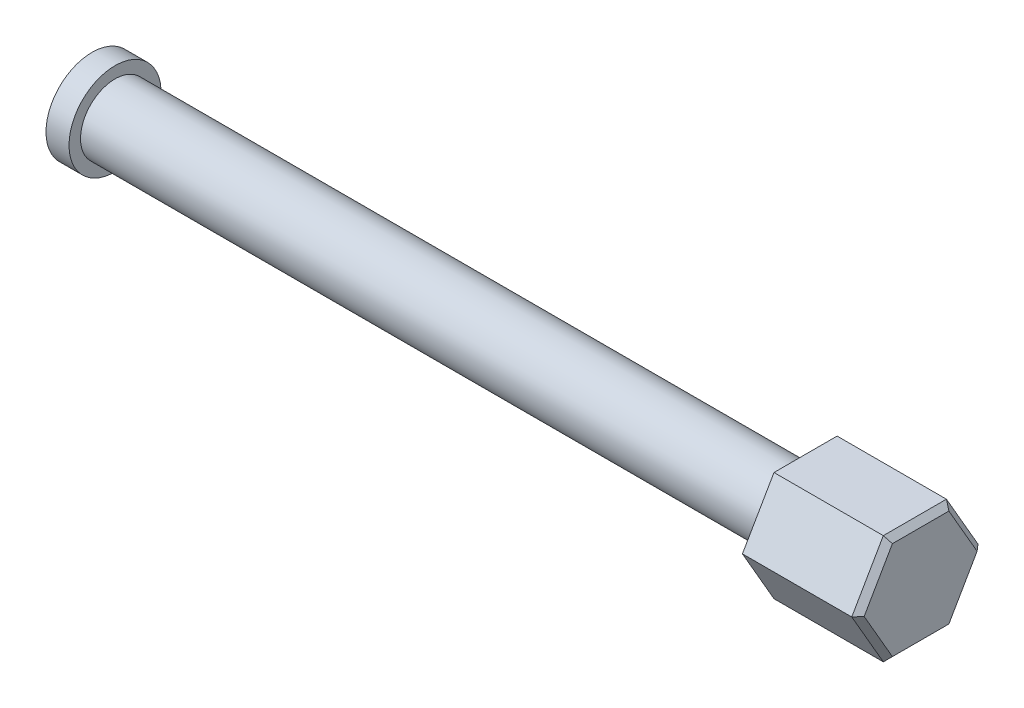
ISO-10303-21;
HEADER;
FILE_DESCRIPTION(('STEP AP214'),'2;1');
FILE_NAME('part.step','',(''),(''),'','','');
FILE_SCHEMA(('AUTOMOTIVE_DESIGN { 1 0 10303 214 1 1 1 1 }'));
ENDSEC;
DATA;
#1=APPLICATION_CONTEXT('core data for automotive mechanical design processes');
#2=APPLICATION_PROTOCOL_DEFINITION('international standard','automotive_design',2000,#1);
#3=PRODUCT_CONTEXT('',#1,'mechanical');
#4=PRODUCT('Part','Part','',(#3));
#5=PRODUCT_RELATED_PRODUCT_CATEGORY('part','',(#4));
#6=PRODUCT_DEFINITION_FORMATION('','',#4);
#7=PRODUCT_DEFINITION_CONTEXT('part definition',#1,'design');
#8=PRODUCT_DEFINITION('design','',#6,#7);
#9=PRODUCT_DEFINITION_SHAPE('','',#8);
#10=(LENGTH_UNIT() NAMED_UNIT(*) SI_UNIT(.MILLI.,.METRE.));
#11=(NAMED_UNIT(*) PLANE_ANGLE_UNIT() SI_UNIT($,.RADIAN.));
#12=(NAMED_UNIT(*) SI_UNIT($,.STERADIAN.) SOLID_ANGLE_UNIT());
#13=UNCERTAINTY_MEASURE_WITH_UNIT(LENGTH_MEASURE(1.E-05),#10,'distance_accuracy_value','');
#14=(GEOMETRIC_REPRESENTATION_CONTEXT(3) GLOBAL_UNCERTAINTY_ASSIGNED_CONTEXT((#13)) GLOBAL_UNIT_ASSIGNED_CONTEXT((#10,
#11,#12)) REPRESENTATION_CONTEXT('',''));
#15=CARTESIAN_POINT('',(0.,0.,0.));
#16=DIRECTION('',(0.,0.,1.));
#17=DIRECTION('',(1.,0.,0.));
#18=AXIS2_PLACEMENT_3D('',#15,#16,#17);
#19=CARTESIAN_POINT('',(59.3548577223939,0.,-6.));
#20=DIRECTION('',(1.,0.,0.));
#21=DIRECTION('',(0.,0.,-1.));
#22=AXIS2_PLACEMENT_3D('',#19,#20,#21);
#23=PLANE('',#22);
#24=CARTESIAN_POINT('',(59.3548577223939,0.,0.));
#25=DIRECTION('',(-1.,0.,0.));
#26=DIRECTION('',(0.,0.,1.));
#27=AXIS2_PLACEMENT_3D('',#24,#25,#26);
#28=CIRCLE('',#27,6.);
#29=CARTESIAN_POINT('',(59.3548577223939,0.,6.));
#30=VERTEX_POINT('',#29);
#31=EDGE_CURVE('E146',#30,#30,#28,.T.);
#32=ORIENTED_EDGE('',*,*,#31,.F.);
#33=EDGE_LOOP('',(#32));
#34=FACE_BOUND('',#33,.T.);
#35=DIRECTION('',(0.,0.866025403784439,-0.5));
#36=VECTOR('',#35,1.);
#37=CARTESIAN_POINT('',(59.3548577223939,-9.50000000000001,-5.48482755730145));
#38=LINE('',#37,#36);
#39=CARTESIAN_POINT('',(59.3548577223939,-9.50000000000001,-5.48482755730145));
#40=VERTEX_POINT('',#39);
#41=CARTESIAN_POINT('',(59.3548577223939,0.,-10.9696551146029));
#42=VERTEX_POINT('',#41);
#43=EDGE_CURVE('E201',#40,#42,#38,.T.);
#44=ORIENTED_EDGE('',*,*,#43,.F.);
#45=DIRECTION('',(0.,0.,-1.));
#46=VECTOR('',#45,1.);
#47=CARTESIAN_POINT('',(59.3548577223939,-9.50000000000001,5.48482755730145));
#48=LINE('',#47,#46);
#49=CARTESIAN_POINT('',(59.3548577223939,-9.50000000000001,5.48482755730145));
#50=VERTEX_POINT('',#49);
#51=EDGE_CURVE('E136',#50,#40,#48,.T.);
#52=ORIENTED_EDGE('',*,*,#51,.F.);
#53=DIRECTION('',(0.,-0.866025403784439,-0.5));
#54=VECTOR('',#53,1.);
#55=CARTESIAN_POINT('',(59.3548577223939,0.,10.9696551146029));
#56=LINE('',#55,#54);
#57=CARTESIAN_POINT('',(59.3548577223939,0.,10.9696551146029));
#58=VERTEX_POINT('',#57);
#59=EDGE_CURVE('E134',#58,#50,#56,.T.);
#60=ORIENTED_EDGE('',*,*,#59,.F.);
#61=DIRECTION('',(0.,-0.866025403784439,0.5));
#62=VECTOR('',#61,1.);
#63=CARTESIAN_POINT('',(59.3548577223939,9.50000000000001,5.48482755730145));
#64=LINE('',#63,#62);
#65=CARTESIAN_POINT('',(59.3548577223939,9.50000000000001,5.48482755730145));
#66=VERTEX_POINT('',#65);
#67=EDGE_CURVE('E116',#66,#58,#64,.T.);
#68=ORIENTED_EDGE('',*,*,#67,.F.);
#69=DIRECTION('',(0.,0.,1.));
#70=VECTOR('',#69,1.);
#71=CARTESIAN_POINT('',(59.3548577223939,9.50000000000001,-5.48482755730145));
#72=LINE('',#71,#70);
#73=CARTESIAN_POINT('',(59.3548577223939,9.50000000000001,-5.48482755730145));
#74=VERTEX_POINT('',#73);
#75=EDGE_CURVE('E124',#74,#66,#72,.T.);
#76=ORIENTED_EDGE('',*,*,#75,.F.);
#77=DIRECTION('',(0.,0.866025403784439,0.5));
#78=VECTOR('',#77,1.);
#79=CARTESIAN_POINT('',(59.3548577223939,0.,-10.9696551146029));
#80=LINE('',#79,#78);
#81=EDGE_CURVE('E129',#42,#74,#80,.T.);
#82=ORIENTED_EDGE('',*,*,#81,.F.);
#83=EDGE_LOOP('',(#44,#52,#60,#68,#76,#82));
#84=FACE_BOUND('',#83,.T.);
#85=ADVANCED_FACE('F39',(#34,#84),#23,.F.);
#86=CARTESIAN_POINT('',(-64.6451422776061,0.,0.));
#87=DIRECTION('',(1.,0.,0.));
#88=DIRECTION('',(0.,0.,-1.));
#89=AXIS2_PLACEMENT_3D('',#86,#87,#88);
#90=PLANE('',#89);
#91=CARTESIAN_POINT('',(-64.6451422776061,0.,0.));
#92=DIRECTION('',(-1.,0.,0.));
#93=DIRECTION('',(0.,0.,1.));
#94=AXIS2_PLACEMENT_3D('',#91,#92,#93);
#95=CIRCLE('',#94,3.);
#96=CARTESIAN_POINT('',(-64.6451422776061,0.,2.99999999999999));
#97=VERTEX_POINT('',#96);
#98=EDGE_CURVE('E210',#97,#97,#95,.T.);
#99=ORIENTED_EDGE('',*,*,#98,.F.);
#100=EDGE_LOOP('',(#99));
#101=FACE_BOUND('',#100,.T.);
#102=CARTESIAN_POINT('',(-64.6451422776061,0.,0.));
#103=DIRECTION('',(-1.,0.,0.));
#104=DIRECTION('',(0.,0.,1.));
#105=AXIS2_PLACEMENT_3D('',#102,#103,#104);
#106=CIRCLE('',#105,8.);
#107=CARTESIAN_POINT('',(-64.6451422776061,0.,8.));
#108=VERTEX_POINT('',#107);
#109=EDGE_CURVE('E161',#108,#108,#106,.T.);
#110=ORIENTED_EDGE('',*,*,#109,.T.);
#111=EDGE_LOOP('',(#110));
#112=FACE_BOUND('',#111,.T.);
#113=ADVANCED_FACE('F216',(#101,#112),#90,.F.);
#114=CARTESIAN_POINT('',(-81.5752481849163,0.,0.));
#115=DIRECTION('',(-1.,0.,0.));
#116=DIRECTION('',(0.,0.,1.));
#117=AXIS2_PLACEMENT_3D('',#114,#115,#116);
#118=CYLINDRICAL_SURFACE('',#117,8.);
#119=ORIENTED_EDGE('',*,*,#109,.F.);
#120=EDGE_LOOP('',(#119));
#121=FACE_BOUND('',#120,.T.);
#122=CARTESIAN_POINT('',(-60.6451422776061,0.,0.));
#123=DIRECTION('',(-1.,0.,0.));
#124=DIRECTION('',(0.,0.,1.));
#125=AXIS2_PLACEMENT_3D('',#122,#123,#124);
#126=CIRCLE('',#125,8.);
#127=CARTESIAN_POINT('',(-60.6451422776061,0.,8.));
#128=VERTEX_POINT('',#127);
#129=EDGE_CURVE('E158',#128,#128,#126,.T.);
#130=ORIENTED_EDGE('',*,*,#129,.T.);
#131=EDGE_LOOP('',(#130));
#132=FACE_BOUND('',#131,.T.);
#133=ADVANCED_FACE('F219',(#121,#132),#118,.T.);
#134=CARTESIAN_POINT('',(-60.6451422776061,0.,-8.));
#135=DIRECTION('',(-1.,0.,0.));
#136=DIRECTION('',(0.,0.,1.));
#137=AXIS2_PLACEMENT_3D('',#134,#135,#136);
#138=PLANE('',#137);
#139=ORIENTED_EDGE('',*,*,#129,.F.);
#140=EDGE_LOOP('',(#139));
#141=FACE_BOUND('',#140,.T.);
#142=CARTESIAN_POINT('',(-60.6451422776061,0.,0.));
#143=DIRECTION('',(-1.,0.,0.));
#144=DIRECTION('',(0.,0.,1.));
#145=AXIS2_PLACEMENT_3D('',#142,#143,#144);
#146=CIRCLE('',#145,6.);
#147=CARTESIAN_POINT('',(-60.6451422776061,0.,6.));
#148=VERTEX_POINT('',#147);
#149=EDGE_CURVE('E155',#148,#148,#146,.T.);
#150=ORIENTED_EDGE('',*,*,#149,.T.);
#151=EDGE_LOOP('',(#150));
#152=FACE_BOUND('',#151,.T.);
#153=ADVANCED_FACE('F225',(#141,#152),#138,.F.);
#154=CARTESIAN_POINT('',(-81.5752481849163,0.,0.));
#155=DIRECTION('',(-1.,0.,0.));
#156=DIRECTION('',(0.,0.,1.));
#157=AXIS2_PLACEMENT_3D('',#154,#155,#156);
#158=CYLINDRICAL_SURFACE('',#157,6.);
#159=ORIENTED_EDGE('',*,*,#149,.F.);
#160=EDGE_LOOP('',(#159));
#161=FACE_BOUND('',#160,.T.);
#162=ORIENTED_EDGE('',*,*,#31,.T.);
#163=EDGE_LOOP('',(#162));
#164=FACE_BOUND('',#163,.T.);
#165=ADVANCED_FACE('F231',(#161,#164),#158,.T.);
#166=CARTESIAN_POINT('',(59.3548577223939,-9.50000000000001,-5.48482755730145));
#167=DIRECTION('',(0.,-0.5,-0.866025403784439));
#168=DIRECTION('',(0.,0.866025403784439,-0.5));
#169=AXIS2_PLACEMENT_3D('',#166,#167,#168);
#170=PLANE('',#169);
#171=DIRECTION('',(1.,0.,0.));
#172=VECTOR('',#171,1.);
#173=CARTESIAN_POINT('',(59.3548577223939,0.,-10.9696551146029));
#174=LINE('',#173,#172);
#175=CARTESIAN_POINT('',(78.3548577223939,0.,-10.9696551146029));
#176=VERTEX_POINT('',#175);
#177=EDGE_CURVE('E142',#42,#176,#174,.T.);
#178=ORIENTED_EDGE('',*,*,#177,.T.);
#179=DIRECTION('',(0.,-0.866025403784439,0.5));
#180=VECTOR('',#179,1.);
#181=CARTESIAN_POINT('',(78.3548577223939,-9.50000000000001,-5.48482755730145));
#182=LINE('',#181,#180);
#183=CARTESIAN_POINT('',(78.3548577223939,-9.50000000000001,-5.48482755730145));
#184=VERTEX_POINT('',#183);
#185=EDGE_CURVE('E12',#176,#184,#182,.T.);
#186=ORIENTED_EDGE('',*,*,#185,.T.);
#187=DIRECTION('',(1.,0.,0.));
#188=VECTOR('',#187,1.);
#189=CARTESIAN_POINT('',(59.3548577223939,-9.50000000000001,-5.48482755730145));
#190=LINE('',#189,#188);
#191=EDGE_CURVE('E143',#40,#184,#190,.T.);
#192=ORIENTED_EDGE('',*,*,#191,.F.);
#193=ORIENTED_EDGE('',*,*,#43,.T.);
#194=EDGE_LOOP('',(#178,#186,#192,#193));
#195=FACE_BOUND('',#194,.T.);
#196=ADVANCED_FACE('F237',(#195),#170,.T.);
#197=CARTESIAN_POINT('',(59.3548577223939,-9.50000000000001,5.48482755730145));
#198=DIRECTION('',(0.,-1.,0.));
#199=DIRECTION('',(0.,0.,-1.));
#200=AXIS2_PLACEMENT_3D('',#197,#198,#199);
#201=PLANE('',#200);
#202=ORIENTED_EDGE('',*,*,#191,.T.);
#203=DIRECTION('',(0.,0.,1.));
#204=VECTOR('',#203,1.);
#205=CARTESIAN_POINT('',(78.3548577223939,-9.50000000000001,5.48482755730145));
#206=LINE('',#205,#204);
#207=CARTESIAN_POINT('',(78.3548577223939,-9.50000000000001,5.48482755730145));
#208=VERTEX_POINT('',#207);
#209=EDGE_CURVE('E177',#184,#208,#206,.T.);
#210=ORIENTED_EDGE('',*,*,#209,.T.);
#211=DIRECTION('',(1.,0.,0.));
#212=VECTOR('',#211,1.);
#213=CARTESIAN_POINT('',(59.3548577223939,-9.50000000000001,5.48482755730145));
#214=LINE('',#213,#212);
#215=EDGE_CURVE('E147',#50,#208,#214,.T.);
#216=ORIENTED_EDGE('',*,*,#215,.F.);
#217=ORIENTED_EDGE('',*,*,#51,.T.);
#218=EDGE_LOOP('',(#202,#210,#216,#217));
#219=FACE_BOUND('',#218,.T.);
#220=ADVANCED_FACE('F282',(#219),#201,.T.);
#221=CARTESIAN_POINT('',(59.3548577223939,0.,10.9696551146029));
#222=DIRECTION('',(0.,-0.5,0.866025403784439));
#223=DIRECTION('',(0.,-0.866025403784439,-0.5));
#224=AXIS2_PLACEMENT_3D('',#221,#222,#223);
#225=PLANE('',#224);
#226=ORIENTED_EDGE('',*,*,#215,.T.);
#227=DIRECTION('',(0.,0.866025403784439,0.5));
#228=VECTOR('',#227,1.);
#229=CARTESIAN_POINT('',(78.3548577223939,0.,10.9696551146029));
#230=LINE('',#229,#228);
#231=CARTESIAN_POINT('',(78.3548577223939,0.,10.9696551146029));
#232=VERTEX_POINT('',#231);
#233=EDGE_CURVE('E180',#208,#232,#230,.T.);
#234=ORIENTED_EDGE('',*,*,#233,.T.);
#235=DIRECTION('',(1.,0.,0.));
#236=VECTOR('',#235,1.);
#237=CARTESIAN_POINT('',(59.3548577223939,0.,10.9696551146029));
#238=LINE('',#237,#236);
#239=EDGE_CURVE('E120',#58,#232,#238,.T.);
#240=ORIENTED_EDGE('',*,*,#239,.F.);
#241=ORIENTED_EDGE('',*,*,#59,.T.);
#242=EDGE_LOOP('',(#226,#234,#240,#241));
#243=FACE_BOUND('',#242,.T.);
#244=ADVANCED_FACE('F289',(#243),#225,.T.);
#245=CARTESIAN_POINT('',(59.3548577223939,9.50000000000001,5.48482755730145));
#246=DIRECTION('',(0.,0.5,0.866025403784439));
#247=DIRECTION('',(0.,-0.866025403784439,0.5));
#248=AXIS2_PLACEMENT_3D('',#245,#246,#247);
#249=PLANE('',#248);
#250=ORIENTED_EDGE('',*,*,#239,.T.);
#251=DIRECTION('',(0.,0.866025403784439,-0.5));
#252=VECTOR('',#251,1.);
#253=CARTESIAN_POINT('',(78.3548577223939,9.50000000000001,5.48482755730145));
#254=LINE('',#253,#252);
#255=CARTESIAN_POINT('',(78.3548577223939,9.50000000000001,5.48482755730145));
#256=VERTEX_POINT('',#255);
#257=EDGE_CURVE('E119',#232,#256,#254,.T.);
#258=ORIENTED_EDGE('',*,*,#257,.T.);
#259=DIRECTION('',(1.,0.,0.));
#260=VECTOR('',#259,1.);
#261=CARTESIAN_POINT('',(59.3548577223939,9.50000000000001,5.48482755730145));
#262=LINE('',#261,#260);
#263=EDGE_CURVE('E111',#66,#256,#262,.T.);
#264=ORIENTED_EDGE('',*,*,#263,.F.);
#265=ORIENTED_EDGE('',*,*,#67,.T.);
#266=EDGE_LOOP('',(#250,#258,#264,#265));
#267=FACE_BOUND('',#266,.T.);
#268=ADVANCED_FACE('F114',(#267),#249,.T.);
#269=CARTESIAN_POINT('',(59.3548577223939,9.50000000000001,-5.48482755730145));
#270=DIRECTION('',(0.,1.,0.));
#271=DIRECTION('',(0.,0.,1.));
#272=AXIS2_PLACEMENT_3D('',#269,#270,#271);
#273=PLANE('',#272);
#274=ORIENTED_EDGE('',*,*,#263,.T.);
#275=DIRECTION('',(0.,0.,-1.));
#276=VECTOR('',#275,1.);
#277=CARTESIAN_POINT('',(78.3548577223939,9.50000000000001,-5.48482755730145));
#278=LINE('',#277,#276);
#279=CARTESIAN_POINT('',(78.3548577223939,9.50000000000001,-5.48482755730145));
#280=VERTEX_POINT('',#279);
#281=EDGE_CURVE('E63',#256,#280,#278,.T.);
#282=ORIENTED_EDGE('',*,*,#281,.T.);
#283=DIRECTION('',(1.,0.,0.));
#284=VECTOR('',#283,1.);
#285=CARTESIAN_POINT('',(59.3548577223939,9.50000000000001,-5.48482755730145));
#286=LINE('',#285,#284);
#287=EDGE_CURVE('E121',#74,#280,#286,.T.);
#288=ORIENTED_EDGE('',*,*,#287,.F.);
#289=ORIENTED_EDGE('',*,*,#75,.T.);
#290=EDGE_LOOP('',(#274,#282,#288,#289));
#291=FACE_BOUND('',#290,.T.);
#292=ADVANCED_FACE('F125',(#291),#273,.T.);
#293=CARTESIAN_POINT('',(59.3548577223939,0.,-10.9696551146029));
#294=DIRECTION('',(0.,0.5,-0.866025403784439));
#295=DIRECTION('',(0.,0.866025403784439,0.5));
#296=AXIS2_PLACEMENT_3D('',#293,#294,#295);
#297=PLANE('',#296);
#298=ORIENTED_EDGE('',*,*,#287,.T.);
#299=DIRECTION('',(0.,-0.866025403784439,-0.5));
#300=VECTOR('',#299,1.);
#301=CARTESIAN_POINT('',(78.3548577223939,0.,-10.9696551146029));
#302=LINE('',#301,#300);
#303=EDGE_CURVE('E48',#280,#176,#302,.T.);
#304=ORIENTED_EDGE('',*,*,#303,.T.);
#305=ORIENTED_EDGE('',*,*,#177,.F.);
#306=ORIENTED_EDGE('',*,*,#81,.T.);
#307=EDGE_LOOP('',(#298,#304,#305,#306));
#308=FACE_BOUND('',#307,.T.);
#309=ADVANCED_FACE('F273',(#308),#297,.T.);
#310=CARTESIAN_POINT('',(79.3548577223939,0.,-11.));
#311=DIRECTION('',(-1.,0.,0.));
#312=DIRECTION('',(0.,0.,1.));
#313=AXIS2_PLACEMENT_3D('',#310,#311,#312);
#314=PLANE('',#313);
#315=DIRECTION('',(0.,-0.866025403784439,-0.5));
#316=VECTOR('',#315,1.);
#317=CARTESIAN_POINT('',(79.3548577223939,-9.,4.61880215351699));
#318=LINE('',#317,#316);
#319=CARTESIAN_POINT('',(79.3548577223939,0.,9.81495457622362));
#320=VERTEX_POINT('',#319);
#321=CARTESIAN_POINT('',(79.3548577223939,-8.49999999999999,4.90747728811181));
#322=VERTEX_POINT('',#321);
#323=EDGE_CURVE('E172',#320,#322,#318,.T.);
#324=ORIENTED_EDGE('',*,*,#323,.T.);
#325=DIRECTION('',(0.,0.,-1.));
#326=VECTOR('',#325,1.);
#327=CARTESIAN_POINT('',(79.3548577223939,-8.49999999999999,-5.48482755730145));
#328=LINE('',#327,#326);
#329=CARTESIAN_POINT('',(79.3548577223939,-8.49999999999999,-4.90747728811181));
#330=VERTEX_POINT('',#329);
#331=EDGE_CURVE('E174',#322,#330,#328,.T.);
#332=ORIENTED_EDGE('',*,*,#331,.T.);
#333=DIRECTION('',(0.,0.866025403784439,-0.5));
#334=VECTOR('',#333,1.);
#335=CARTESIAN_POINT('',(79.3548577223939,0.500000000000012,-10.1036297108184));
#336=LINE('',#335,#334);
#337=CARTESIAN_POINT('',(79.3548577223939,0.,-9.81495457622362));
#338=VERTEX_POINT('',#337);
#339=EDGE_CURVE('E164',#330,#338,#336,.T.);
#340=ORIENTED_EDGE('',*,*,#339,.T.);
#341=DIRECTION('',(0.,0.866025403784439,0.5));
#342=VECTOR('',#341,1.);
#343=CARTESIAN_POINT('',(79.3548577223939,9.,-4.61880215351699));
#344=LINE('',#343,#342);
#345=CARTESIAN_POINT('',(79.3548577223939,8.49999999999999,-4.90747728811181));
#346=VERTEX_POINT('',#345);
#347=EDGE_CURVE('E166',#338,#346,#344,.T.);
#348=ORIENTED_EDGE('',*,*,#347,.T.);
#349=DIRECTION('',(0.,0.,1.));
#350=VECTOR('',#349,1.);
#351=CARTESIAN_POINT('',(79.3548577223939,8.49999999999999,5.48482755730145));
#352=LINE('',#351,#350);
#353=CARTESIAN_POINT('',(79.3548577223939,8.49999999999999,4.90747728811182));
#354=VERTEX_POINT('',#353);
#355=EDGE_CURVE('E168',#346,#354,#352,.T.);
#356=ORIENTED_EDGE('',*,*,#355,.T.);
#357=DIRECTION('',(0.,-0.866025403784439,0.5));
#358=VECTOR('',#357,1.);
#359=CARTESIAN_POINT('',(79.3548577223939,-0.50000000000001,10.1036297108184));
#360=LINE('',#359,#358);
#361=EDGE_CURVE('E170',#354,#320,#360,.T.);
#362=ORIENTED_EDGE('',*,*,#361,.T.);
#363=EDGE_LOOP('',(#324,#332,#340,#348,#356,#362));
#364=FACE_BOUND('',#363,.T.);
#365=ADVANCED_FACE('F247',(#364),#314,.F.);
#366=CARTESIAN_POINT('',(79.3548577223939,8.49999999999999,-11.));
#367=DIRECTION('',(0.707106781186544,0.707106781186551,0.));
#368=DIRECTION('',(0.,0.,-1.));
#369=AXIS2_PLACEMENT_3D('',#366,#367,#368);
#370=PLANE('',#369);
#371=DIRECTION('',(0.654653670707981,-0.654653670707974,0.377964473009226));
#372=VECTOR('',#371,1.);
#373=CARTESIAN_POINT('',(81.9300404997695,5.92481722262447,-3.42069481838156));
#374=LINE('',#373,#372);
#375=EDGE_CURVE('E195',#280,#346,#374,.T.);
#376=ORIENTED_EDGE('',*,*,#375,.F.);
#377=ORIENTED_EDGE('',*,*,#281,.F.);
#378=DIRECTION('',(0.654653670707981,-0.654653670707975,-0.377964473009224));
#379=VECTOR('',#378,1.);
#380=CARTESIAN_POINT('',(83.2909375628593,4.56392015953466,2.63498053266732));
#381=LINE('',#380,#379);
#382=EDGE_CURVE('E43',#354,#256,#381,.F.);
#383=ORIENTED_EDGE('',*,*,#382,.F.);
#384=ORIENTED_EDGE('',*,*,#355,.F.);
#385=EDGE_LOOP('',(#376,#377,#383,#384));
#386=FACE_BOUND('',#385,.T.);
#387=ADVANCED_FACE('F41',(#386),#370,.T.);
#388=CARTESIAN_POINT('',(79.3548577223939,9.0131397208144,4.61121593216772));
#389=DIRECTION('',(0.707106781186543,0.353553390593276,0.612372435695799));
#390=DIRECTION('',(0.,0.866025403784439,-0.5));
#391=AXIS2_PLACEMENT_3D('',#388,#389,#390);
#392=PLANE('',#391);
#393=ORIENTED_EDGE('',*,*,#382,.T.);
#394=ORIENTED_EDGE('',*,*,#257,.F.);
#395=DIRECTION('',(0.654653670707981,0.,-0.755928946018451));
#396=VECTOR('',#395,1.);
#397=CARTESIAN_POINT('',(81.9300404997695,0.,6.84138963676312));
#398=LINE('',#397,#396);
#399=EDGE_CURVE('E193',#320,#232,#398,.F.);
#400=ORIENTED_EDGE('',*,*,#399,.F.);
#401=ORIENTED_EDGE('',*,*,#361,.F.);
#402=EDGE_LOOP('',(#393,#394,#400,#401));
#403=FACE_BOUND('',#402,.T.);
#404=ADVANCED_FACE('F264',(#403),#392,.T.);
#405=CARTESIAN_POINT('',(79.3548577223939,-0.513139720814419,-10.1112159321677));
#406=DIRECTION('',(0.707106781186544,0.353553390593275,-0.612372435695797));
#407=DIRECTION('',(0.,-0.866025403784439,-0.5));
#408=AXIS2_PLACEMENT_3D('',#405,#406,#407);
#409=PLANE('',#408);
#410=ORIENTED_EDGE('',*,*,#375,.T.);
#411=ORIENTED_EDGE('',*,*,#347,.F.);
#412=DIRECTION('',(0.654653670707981,0.,0.755928946018451));
#413=VECTOR('',#412,1.);
#414=CARTESIAN_POINT('',(79.2082463735898,0.,-9.98424677962024));
#415=LINE('',#414,#413);
#416=EDGE_CURVE('E190',#176,#338,#415,.T.);
#417=ORIENTED_EDGE('',*,*,#416,.F.);
#418=ORIENTED_EDGE('',*,*,#303,.F.);
#419=EDGE_LOOP('',(#410,#411,#417,#418));
#420=FACE_BOUND('',#419,.T.);
#421=ADVANCED_FACE('F261',(#420),#409,.T.);
#422=CARTESIAN_POINT('',(79.3548577223939,-9.01313972081441,4.61121593216772));
#423=DIRECTION('',(0.707106781186544,-0.353553390593275,0.612372435695797));
#424=DIRECTION('',(0.,0.866025403784439,0.5));
#425=AXIS2_PLACEMENT_3D('',#422,#423,#424);
#426=PLANE('',#425);
#427=ORIENTED_EDGE('',*,*,#399,.T.);
#428=ORIENTED_EDGE('',*,*,#233,.F.);
#429=DIRECTION('',(0.65465367070798,0.654653670707975,-0.377964473009226));
#430=VECTOR('',#429,1.);
#431=CARTESIAN_POINT('',(79.2082463735898,-8.64661134880411,4.99212338981012));
#432=LINE('',#431,#430);
#433=EDGE_CURVE('E187',#322,#208,#432,.F.);
#434=ORIENTED_EDGE('',*,*,#433,.F.);
#435=ORIENTED_EDGE('',*,*,#323,.F.);
#436=EDGE_LOOP('',(#427,#428,#434,#435));
#437=FACE_BOUND('',#436,.T.);
#438=ADVANCED_FACE('F257',(#437),#426,.T.);
#439=CARTESIAN_POINT('',(79.3548577223939,0.51313972081442,-10.1112159321677));
#440=DIRECTION('',(0.707106781186544,-0.353553390593275,-0.612372435695798));
#441=DIRECTION('',(0.,-0.866025403784439,0.5));
#442=AXIS2_PLACEMENT_3D('',#439,#440,#441);
#443=PLANE('',#442);
#444=ORIENTED_EDGE('',*,*,#416,.T.);
#445=ORIENTED_EDGE('',*,*,#339,.F.);
#446=DIRECTION('',(-0.654653670707981,-0.654653670707975,-0.377964473009225));
#447=VECTOR('',#446,1.);
#448=CARTESIAN_POINT('',(81.9300404997695,-5.92481722262446,-3.42069481838156));
#449=LINE('',#448,#447);
#450=EDGE_CURVE('E185',#184,#330,#449,.F.);
#451=ORIENTED_EDGE('',*,*,#450,.F.);
#452=ORIENTED_EDGE('',*,*,#185,.F.);
#453=EDGE_LOOP('',(#444,#445,#451,#452));
#454=FACE_BOUND('',#453,.T.);
#455=ADVANCED_FACE('F253',(#454),#443,.T.);
#456=CARTESIAN_POINT('',(79.3548577223939,-8.49999999999999,-11.));
#457=DIRECTION('',(0.707106781186544,-0.707106781186551,0.));
#458=DIRECTION('',(0.,0.,1.));
#459=AXIS2_PLACEMENT_3D('',#456,#457,#458);
#460=PLANE('',#459);
#461=ORIENTED_EDGE('',*,*,#433,.T.);
#462=ORIENTED_EDGE('',*,*,#209,.F.);
#463=ORIENTED_EDGE('',*,*,#450,.T.);
#464=ORIENTED_EDGE('',*,*,#331,.F.);
#465=EDGE_LOOP('',(#461,#462,#463,#464));
#466=FACE_BOUND('',#465,.T.);
#467=ADVANCED_FACE('F250',(#466),#460,.T.);
#468=CARTESIAN_POINT('',(-64.6451422776061,0.,0.));
#469=DIRECTION('',(-1.,0.,0.));
#470=DIRECTION('',(0.,0.,1.));
#471=AXIS2_PLACEMENT_3D('',#468,#469,#470);
#472=CONICAL_SURFACE('',#471,3.,0.698131700797732);
#473=CARTESIAN_POINT('',(-61.6451422776061,0.,0.));
#474=DIRECTION('',(-1.,0.,0.));
#475=DIRECTION('',(0.,0.,1.));
#476=AXIS2_PLACEMENT_3D('',#473,#474,#475);
#477=CIRCLE('',#476,0.482701106468155);
#478=CARTESIAN_POINT('',(-61.6451422776061,0.,0.482701106468152));
#479=VERTEX_POINT('',#478);
#480=EDGE_CURVE('E188',#479,#479,#477,.T.);
#481=CARTESIAN_POINT('',(-61.6451422776061,0.,0.482701106468152));
#482=CARTESIAN_POINT('',(-61.6763922776061,0.,0.508922969942441));
#483=CARTESIAN_POINT('',(-61.7076422776061,0.,0.535144833416732));
#484=CARTESIAN_POINT('',(-61.7701422776061,0.,0.587588560365313));
#485=CARTESIAN_POINT('',(-61.8013922776061,0.,0.613810423839603));
#486=CARTESIAN_POINT('',(-61.8638922776061,0.,0.666254150788183));
#487=CARTESIAN_POINT('',(-61.8951422776061,0.,0.692476014262471));
#488=CARTESIAN_POINT('',(-61.9576422776061,0.,0.744919741211052));
#489=CARTESIAN_POINT('',(-61.9888922776061,0.,0.771141604685343));
#490=CARTESIAN_POINT('',(-62.0513922776061,0.,0.823585331633923));
#491=CARTESIAN_POINT('',(-62.0826422776061,0.,0.849807195108212));
#492=CARTESIAN_POINT('',(-62.1451422776061,0.,0.902250922056792));
#493=CARTESIAN_POINT('',(-62.1763922776061,0.,0.928472785531083));
#494=CARTESIAN_POINT('',(-62.2388922776061,0.,0.980916512479663));
#495=CARTESIAN_POINT('',(-62.2701422776061,0.,1.00713837595395));
#496=CARTESIAN_POINT('',(-62.3326422776061,0.,1.05958210290253));
#497=CARTESIAN_POINT('',(-62.3638922776061,0.,1.08580396637682));
#498=CARTESIAN_POINT('',(-62.4263922776061,0.,1.1382476933254));
#499=CARTESIAN_POINT('',(-62.4576422776061,0.,1.16446955679969));
#500=CARTESIAN_POINT('',(-62.5201422776061,0.,1.21691328374827));
#501=CARTESIAN_POINT('',(-62.5513922776061,0.,1.24313514722256));
#502=CARTESIAN_POINT('',(-62.6138922776061,0.,1.29557887417114));
#503=CARTESIAN_POINT('',(-62.6451422776061,0.,1.32180073764543));
#504=CARTESIAN_POINT('',(-62.7076422776061,0.,1.37424446459401));
#505=CARTESIAN_POINT('',(-62.7388922776061,0.,1.4004663280683));
#506=CARTESIAN_POINT('',(-62.8013922776061,0.,1.45291005501688));
#507=CARTESIAN_POINT('',(-62.8326422776061,0.,1.47913191849117));
#508=CARTESIAN_POINT('',(-62.8951422776061,0.,1.53157564543975));
#509=CARTESIAN_POINT('',(-62.9263922776061,0.,1.55779750891404));
#510=CARTESIAN_POINT('',(-62.9888922776061,0.,1.61024123586262));
#511=CARTESIAN_POINT('',(-63.0201422776061,0.,1.63646309933691));
#512=CARTESIAN_POINT('',(-63.0826422776061,0.,1.68890682628549));
#513=CARTESIAN_POINT('',(-63.1138922776061,0.,1.71512868975978));
#514=CARTESIAN_POINT('',(-63.1763922776061,0.,1.76757241670836));
#515=CARTESIAN_POINT('',(-63.2076422776061,0.,1.79379428018265));
#516=CARTESIAN_POINT('',(-63.2701422776061,0.,1.84623800713123));
#517=CARTESIAN_POINT('',(-63.3013922776061,0.,1.87245987060552));
#518=CARTESIAN_POINT('',(-63.3638922776061,0.,1.9249035975541));
#519=CARTESIAN_POINT('',(-63.3951422776061,0.,1.95112546102839));
#520=CARTESIAN_POINT('',(-63.4576422776061,0.,2.00356918797697));
#521=CARTESIAN_POINT('',(-63.4888922776061,0.,2.02979105145126));
#522=CARTESIAN_POINT('',(-63.5513922776061,0.,2.08223477839984));
#523=CARTESIAN_POINT('',(-63.5826422776061,0.,2.10845664187413));
#524=CARTESIAN_POINT('',(-63.6451422776061,0.,2.16090036882272));
#525=CARTESIAN_POINT('',(-63.6763922776061,0.,2.187122232297));
#526=CARTESIAN_POINT('',(-63.7388922776061,0.,2.23956595924558));
#527=CARTESIAN_POINT('',(-63.7701422776061,0.,2.26578782271987));
#528=CARTESIAN_POINT('',(-63.8326422776061,0.,2.31823154966845));
#529=CARTESIAN_POINT('',(-63.8638922776061,0.,2.34445341314274));
#530=CARTESIAN_POINT('',(-63.9263922776061,0.,2.39689714009132));
#531=CARTESIAN_POINT('',(-63.9576422776061,0.,2.42311900356561));
#532=CARTESIAN_POINT('',(-64.0201422776061,0.,2.4755627305142));
#533=CARTESIAN_POINT('',(-64.0513922776061,0.,2.50178459398848));
#534=CARTESIAN_POINT('',(-64.1138922776061,0.,2.55422832093706));
#535=CARTESIAN_POINT('',(-64.1451422776061,0.,2.58045018441135));
#536=CARTESIAN_POINT('',(-64.2076422776061,0.,2.63289391135993));
#537=CARTESIAN_POINT('',(-64.2388922776061,0.,2.65911577483422));
#538=CARTESIAN_POINT('',(-64.3013922776061,0.,2.7115595017828));
#539=CARTESIAN_POINT('',(-64.3326422776061,0.,2.7377813652571));
#540=CARTESIAN_POINT('',(-64.3951422776061,0.,2.79022509220568));
#541=CARTESIAN_POINT('',(-64.4263922776061,0.,2.81644695567996));
#542=CARTESIAN_POINT('',(-64.4888922776061,0.,2.86889068262854));
#543=CARTESIAN_POINT('',(-64.5201422776061,0.,2.89511254610283));
#544=CARTESIAN_POINT('',(-64.5826422776061,0.,2.94755627305141));
#545=CARTESIAN_POINT('',(-64.6138922776061,0.,2.97377813652571));
#546=CARTESIAN_POINT('',(-64.6451422776061,0.,2.99999999999999));
#547=B_SPLINE_CURVE_WITH_KNOTS('',3,(#481,#482,#483,#484,#485,#486,#487,#488,#489,#490,#491,
#492,#493,#494,#495,#496,#497,#498,#499,#500,#501,#502,#503,#504,#505,#506,#507,#508,#509,#510,
#511,#512,#513,#514,#515,#516,#517,#518,#519,#520,#521,#522,#523,#524,#525,#526,#527,#528,#529,
#530,#531,#532,#533,#534,#535,#536,#537,#538,#539,#540,#541,#542,#543,#544,#545,#546),
.UNSPECIFIED.,.F.,.F.,(4,2,2,2,2,2,2,2,2,2,2,2,2,2,2,2,2,2,2,2,2,2,2,2,2,2,2,2,2,2,2,2,4),(0.,
0.122381933374899,0.244763866749797,0.367145800124701,0.4895277334996,0.611909666874504,
0.734291600249402,0.856673533624306,0.979055466999205,1.10143740037411,1.22381933374901,
1.34620126712391,1.46858320049882,1.59096513387371,1.71334706724861,1.83572900062352,
1.95811093399842,2.08049286737331,2.20287480074822,2.32525673412312,2.44763866749802,
2.57002060087292,2.69240253424782,2.81478446762273,2.93716640099763,3.05954833437252,
3.18193026774743,3.30431220112233,3.42669413449723,3.54907606787213,3.67145800124703,
3.79383993462194,3.91622186799684),.UNSPECIFIED.);
#548=EDGE_CURVE('BSEAM214',#479,#97,#547,.T.);
#549=ORIENTED_EDGE('',*,*,#480,.F.);
#550=ORIENTED_EDGE('',*,*,#98,.T.);
#551=ORIENTED_EDGE('',*,*,#548,.T.);
#552=ORIENTED_EDGE('',*,*,#548,.F.);
#553=EDGE_LOOP('',(#549,#551,#550,#552));
#554=FACE_BOUND('',#553,.T.);
#555=ADVANCED_FACE('F214',(#554),#472,.F.);
#556=CARTESIAN_POINT('',(-61.6451422776061,0.,0.));
#557=DIRECTION('',(-1.,0.,0.));
#558=DIRECTION('',(0.,0.,1.));
#559=AXIS2_PLACEMENT_3D('',#556,#557,#558);
#560=PLANE('',#559);
#561=ORIENTED_EDGE('',*,*,#480,.T.);
#562=EDGE_LOOP('',(#561));
#563=FACE_BOUND('',#562,.T.);
#564=ADVANCED_FACE('F373',(#563),#560,.T.);
#565=CLOSED_SHELL('',(#85,#113,#133,#153,#165,#196,#220,#244,#268,#292,#309,#365,#387,#404,#421,
#438,#455,#467,#555,#564));
#566=MANIFOLD_SOLID_BREP('B2',#565);
#567=ADVANCED_BREP_SHAPE_REPRESENTATION('',(#18,#566),#14);
#568=SHAPE_DEFINITION_REPRESENTATION(#9,#567);
ENDSEC;
END-ISO-10303-21;
